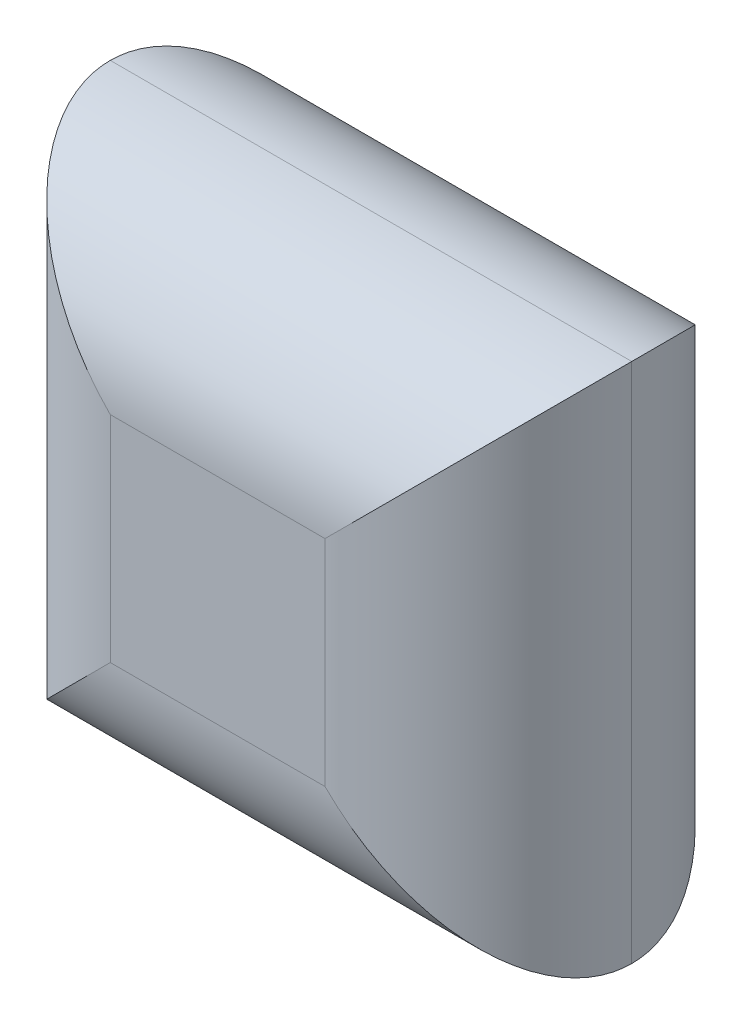
ISO-10303-21;
HEADER;
FILE_DESCRIPTION(('STEP AP214'),'2;1');
FILE_NAME('part.step','',(''),(''),'','','');
FILE_SCHEMA(('AUTOMOTIVE_DESIGN { 1 0 10303 214 1 1 1 1 }'));
ENDSEC;
DATA;
#1=APPLICATION_CONTEXT('core data for automotive mechanical design processes');
#2=APPLICATION_PROTOCOL_DEFINITION('international standard','automotive_design',2000,#1);
#3=PRODUCT_CONTEXT('',#1,'mechanical');
#4=PRODUCT('Part','Part','',(#3));
#5=PRODUCT_RELATED_PRODUCT_CATEGORY('part','',(#4));
#6=PRODUCT_DEFINITION_FORMATION('','',#4);
#7=PRODUCT_DEFINITION_CONTEXT('part definition',#1,'design');
#8=PRODUCT_DEFINITION('design','',#6,#7);
#9=PRODUCT_DEFINITION_SHAPE('','',#8);
#10=(LENGTH_UNIT() NAMED_UNIT(*) SI_UNIT(.MILLI.,.METRE.));
#11=(NAMED_UNIT(*) PLANE_ANGLE_UNIT() SI_UNIT($,.RADIAN.));
#12=(NAMED_UNIT(*) SI_UNIT($,.STERADIAN.) SOLID_ANGLE_UNIT());
#13=UNCERTAINTY_MEASURE_WITH_UNIT(LENGTH_MEASURE(1.E-05),#10,'distance_accuracy_value','');
#14=(GEOMETRIC_REPRESENTATION_CONTEXT(3) GLOBAL_UNCERTAINTY_ASSIGNED_CONTEXT((#13)) GLOBAL_UNIT_ASSIGNED_CONTEXT((#10,
#11,#12)) REPRESENTATION_CONTEXT('',''));
#15=CARTESIAN_POINT('',(0.,0.,0.));
#16=DIRECTION('',(0.,0.,1.));
#17=DIRECTION('',(1.,0.,0.));
#18=AXIS2_PLACEMENT_3D('',#15,#16,#17);
#19=CARTESIAN_POINT('',(0.,0.,100.));
#20=DIRECTION('',(0.,0.,-1.));
#21=DIRECTION('',(-1.,0.,0.));
#22=AXIS2_PLACEMENT_3D('',#19,#20,#21);
#23=PLANE('',#22);
#24=DIRECTION('',(0.,1.,0.));
#25=VECTOR('',#24,1.);
#26=CARTESIAN_POINT('',(120.,0.,100.));
#27=LINE('',#26,#25);
#28=CARTESIAN_POINT('',(120.,50.,100.));
#29=VERTEX_POINT('',#28);
#30=CARTESIAN_POINT('',(120.,120.,100.));
#31=VERTEX_POINT('',#30);
#32=EDGE_CURVE('E47',#29,#31,#27,.T.);
#33=ORIENTED_EDGE('',*,*,#32,.T.);
#34=DIRECTION('',(-1.,0.,0.));
#35=VECTOR('',#34,1.);
#36=CARTESIAN_POINT('',(0.,120.,100.));
#37=LINE('',#36,#35);
#38=CARTESIAN_POINT('',(50.,120.,100.));
#39=VERTEX_POINT('',#38);
#40=EDGE_CURVE('E11',#31,#39,#37,.T.);
#41=ORIENTED_EDGE('',*,*,#40,.T.);
#42=DIRECTION('',(0.,-1.,0.));
#43=VECTOR('',#42,1.);
#44=CARTESIAN_POINT('',(50.,0.,100.));
#45=LINE('',#44,#43);
#46=CARTESIAN_POINT('',(50.,50.,100.));
#47=VERTEX_POINT('',#46);
#48=EDGE_CURVE('E97',#39,#47,#45,.T.);
#49=ORIENTED_EDGE('',*,*,#48,.T.);
#50=DIRECTION('',(1.,0.,0.));
#51=VECTOR('',#50,1.);
#52=CARTESIAN_POINT('',(0.,50.,100.));
#53=LINE('',#52,#51);
#54=EDGE_CURVE('E100',#47,#29,#53,.T.);
#55=ORIENTED_EDGE('',*,*,#54,.T.);
#56=EDGE_LOOP('',(#33,#41,#49,#55));
#57=FACE_BOUND('',#56,.T.);
#58=ADVANCED_FACE('F37',(#57),#23,.F.);
#59=CARTESIAN_POINT('',(0.,0.,0.));
#60=DIRECTION('',(0.,0.,-1.));
#61=DIRECTION('',(-1.,0.,0.));
#62=AXIS2_PLACEMENT_3D('',#59,#60,#61);
#63=PLANE('',#62);
#64=DIRECTION('',(0.,1.,0.));
#65=VECTOR('',#64,1.);
#66=CARTESIAN_POINT('',(120.,0.,0.));
#67=LINE('',#66,#65);
#68=CARTESIAN_POINT('',(120.,120.,0.));
#69=VERTEX_POINT('',#68);
#70=CARTESIAN_POINT('',(120.,50.,0.));
#71=VERTEX_POINT('',#70);
#72=EDGE_CURVE('E144',#69,#71,#67,.F.);
#73=ORIENTED_EDGE('',*,*,#72,.T.);
#74=DIRECTION('',(1.,0.,0.));
#75=VECTOR('',#74,1.);
#76=CARTESIAN_POINT('',(0.,50.,0.));
#77=LINE('',#76,#75);
#78=CARTESIAN_POINT('',(50.,50.,0.));
#79=VERTEX_POINT('',#78);
#80=EDGE_CURVE('E101',#71,#79,#77,.F.);
#81=ORIENTED_EDGE('',*,*,#80,.T.);
#82=DIRECTION('',(0.,-1.,0.));
#83=VECTOR('',#82,1.);
#84=CARTESIAN_POINT('',(50.,170.,0.));
#85=LINE('',#84,#83);
#86=CARTESIAN_POINT('',(50.,120.,0.));
#87=VERTEX_POINT('',#86);
#88=EDGE_CURVE('E138',#79,#87,#85,.F.);
#89=ORIENTED_EDGE('',*,*,#88,.T.);
#90=DIRECTION('',(-1.,0.,0.));
#91=VECTOR('',#90,1.);
#92=CARTESIAN_POINT('',(170.,120.,0.));
#93=LINE('',#92,#91);
#94=EDGE_CURVE('E139',#87,#69,#93,.F.);
#95=ORIENTED_EDGE('',*,*,#94,.T.);
#96=EDGE_LOOP('',(#73,#81,#89,#95));
#97=FACE_BOUND('',#96,.T.);
#98=ADVANCED_FACE('F147',(#97),#63,.T.);
#99=CARTESIAN_POINT('',(0.,120.,50.));
#100=DIRECTION('',(-1.,0.,0.));
#101=DIRECTION('',(0.,0.,1.));
#102=AXIS2_PLACEMENT_3D('',#99,#100,#101);
#103=CYLINDRICAL_SURFACE('',#102,50.);
#104=CARTESIAN_POINT('',(50.,120.,50.));
#105=DIRECTION('',(-0.707106781186547,-0.707106781186547,0.));
#106=DIRECTION('',(0.707106781186547,-0.707106781186547,0.));
#107=AXIS2_PLACEMENT_3D('',#104,#105,#106);
#108=ELLIPSE('',#107,70.7106781186548,50.);
#109=CARTESIAN_POINT('',(0.,170.,50.));
#110=VERTEX_POINT('',#109);
#111=EDGE_CURVE('E41',#39,#110,#108,.T.);
#112=ORIENTED_EDGE('',*,*,#111,.F.);
#113=ORIENTED_EDGE('',*,*,#40,.F.);
#114=CARTESIAN_POINT('',(120.,120.,50.));
#115=DIRECTION('',(-0.707106781186547,0.707106781186547,0.));
#116=DIRECTION('',(0.707106781186547,0.707106781186547,0.));
#117=AXIS2_PLACEMENT_3D('',#114,#115,#116);
#118=ELLIPSE('',#117,70.7106781186548,50.);
#119=CARTESIAN_POINT('',(170.,170.,50.));
#120=VERTEX_POINT('',#119);
#121=EDGE_CURVE('E70',#120,#31,#118,.F.);
#122=ORIENTED_EDGE('',*,*,#121,.F.);
#123=DIRECTION('',(-1.,0.,0.));
#124=VECTOR('',#123,1.);
#125=CARTESIAN_POINT('',(0.,170.,50.));
#126=LINE('',#125,#124);
#127=EDGE_CURVE('E135',#110,#120,#126,.F.);
#128=ORIENTED_EDGE('',*,*,#127,.F.);
#129=EDGE_LOOP('',(#112,#113,#122,#128));
#130=FACE_BOUND('',#129,.T.);
#131=ADVANCED_FACE('F39',(#130),#103,.T.);
#132=CARTESIAN_POINT('',(50.,0.,50.));
#133=DIRECTION('',(0.,-1.,0.));
#134=DIRECTION('',(0.,0.,-1.));
#135=AXIS2_PLACEMENT_3D('',#132,#133,#134);
#136=CYLINDRICAL_SURFACE('',#135,50.);
#137=ORIENTED_EDGE('',*,*,#48,.F.);
#138=ORIENTED_EDGE('',*,*,#111,.T.);
#139=DIRECTION('',(0.,-1.,0.));
#140=VECTOR('',#139,1.);
#141=CARTESIAN_POINT('',(0.,0.,50.));
#142=LINE('',#141,#140);
#143=CARTESIAN_POINT('',(0.,0.,50.));
#144=VERTEX_POINT('',#143);
#145=EDGE_CURVE('E107',#144,#110,#142,.F.);
#146=ORIENTED_EDGE('',*,*,#145,.F.);
#147=CARTESIAN_POINT('',(50.,50.,50.));
#148=DIRECTION('',(0.707106781186547,-0.707106781186547,0.));
#149=DIRECTION('',(-0.707106781186547,-0.707106781186547,0.));
#150=AXIS2_PLACEMENT_3D('',#147,#148,#149);
#151=ELLIPSE('',#150,70.7106781186548,50.);
#152=EDGE_CURVE('E104',#47,#144,#151,.T.);
#153=ORIENTED_EDGE('',*,*,#152,.F.);
#154=EDGE_LOOP('',(#137,#138,#146,#153));
#155=FACE_BOUND('',#154,.T.);
#156=ADVANCED_FACE('F105',(#155),#136,.T.);
#157=CARTESIAN_POINT('',(120.,0.,50.));
#158=DIRECTION('',(0.,1.,0.));
#159=DIRECTION('',(0.,0.,1.));
#160=AXIS2_PLACEMENT_3D('',#157,#158,#159);
#161=CYLINDRICAL_SURFACE('',#160,50.);
#162=ORIENTED_EDGE('',*,*,#121,.T.);
#163=ORIENTED_EDGE('',*,*,#32,.F.);
#164=CARTESIAN_POINT('',(120.,50.,50.));
#165=DIRECTION('',(0.707106781186547,0.707106781186547,0.));
#166=DIRECTION('',(0.707106781186547,-0.707106781186547,0.));
#167=AXIS2_PLACEMENT_3D('',#164,#165,#166);
#168=ELLIPSE('',#167,70.7106781186548,50.);
#169=CARTESIAN_POINT('',(170.,0.,50.));
#170=VERTEX_POINT('',#169);
#171=EDGE_CURVE('E110',#170,#29,#168,.F.);
#172=ORIENTED_EDGE('',*,*,#171,.F.);
#173=DIRECTION('',(0.,1.,0.));
#174=VECTOR('',#173,1.);
#175=CARTESIAN_POINT('',(170.,0.,50.));
#176=LINE('',#175,#174);
#177=EDGE_CURVE('E127',#120,#170,#176,.F.);
#178=ORIENTED_EDGE('',*,*,#177,.F.);
#179=EDGE_LOOP('',(#162,#163,#172,#178));
#180=FACE_BOUND('',#179,.T.);
#181=ADVANCED_FACE('F154',(#180),#161,.T.);
#182=CARTESIAN_POINT('',(0.,120.,50.));
#183=DIRECTION('',(1.,0.,0.));
#184=DIRECTION('',(0.,0.,-1.));
#185=AXIS2_PLACEMENT_3D('',#182,#183,#184);
#186=CYLINDRICAL_SURFACE('',#185,50.);
#187=CARTESIAN_POINT('',(120.,120.,50.));
#188=DIRECTION('',(0.707106781186547,-0.707106781186547,0.));
#189=DIRECTION('',(0.707106781186547,0.707106781186547,0.));
#190=AXIS2_PLACEMENT_3D('',#187,#188,#189);
#191=ELLIPSE('',#190,70.7106781186548,50.);
#192=EDGE_CURVE('E124',#69,#120,#191,.T.);
#193=ORIENTED_EDGE('',*,*,#192,.F.);
#194=ORIENTED_EDGE('',*,*,#94,.F.);
#195=CARTESIAN_POINT('',(50.,120.,50.));
#196=DIRECTION('',(0.707106781186547,0.707106781186547,0.));
#197=DIRECTION('',(-0.707106781186547,0.707106781186547,0.));
#198=AXIS2_PLACEMENT_3D('',#195,#196,#197);
#199=ELLIPSE('',#198,70.7106781186548,50.);
#200=EDGE_CURVE('E132',#110,#87,#199,.F.);
#201=ORIENTED_EDGE('',*,*,#200,.F.);
#202=ORIENTED_EDGE('',*,*,#127,.T.);
#203=EDGE_LOOP('',(#193,#194,#201,#202));
#204=FACE_BOUND('',#203,.T.);
#205=ADVANCED_FACE('F156',(#204),#186,.T.);
#206=CARTESIAN_POINT('',(50.,0.,50.));
#207=DIRECTION('',(0.,1.,0.));
#208=DIRECTION('',(0.,0.,1.));
#209=AXIS2_PLACEMENT_3D('',#206,#207,#208);
#210=CYLINDRICAL_SURFACE('',#209,50.);
#211=ORIENTED_EDGE('',*,*,#200,.T.);
#212=ORIENTED_EDGE('',*,*,#88,.F.);
#213=CARTESIAN_POINT('',(50.,50.,50.));
#214=DIRECTION('',(-0.707106781186547,0.707106781186547,0.));
#215=DIRECTION('',(0.707106781186547,0.707106781186547,0.));
#216=AXIS2_PLACEMENT_3D('',#213,#214,#215);
#217=ELLIPSE('',#216,70.7106781186548,50.);
#218=EDGE_CURVE('E84',#144,#79,#217,.F.);
#219=ORIENTED_EDGE('',*,*,#218,.F.);
#220=ORIENTED_EDGE('',*,*,#145,.T.);
#221=EDGE_LOOP('',(#211,#212,#219,#220));
#222=FACE_BOUND('',#221,.T.);
#223=ADVANCED_FACE('F162',(#222),#210,.T.);
#224=CARTESIAN_POINT('',(0.,50.,50.));
#225=DIRECTION('',(1.,0.,0.));
#226=DIRECTION('',(0.,0.,-1.));
#227=AXIS2_PLACEMENT_3D('',#224,#225,#226);
#228=CYLINDRICAL_SURFACE('',#227,50.);
#229=ORIENTED_EDGE('',*,*,#54,.F.);
#230=ORIENTED_EDGE('',*,*,#152,.T.);
#231=DIRECTION('',(1.,0.,0.));
#232=VECTOR('',#231,1.);
#233=CARTESIAN_POINT('',(0.,0.,50.));
#234=LINE('',#233,#232);
#235=EDGE_CURVE('E121',#170,#144,#234,.F.);
#236=ORIENTED_EDGE('',*,*,#235,.F.);
#237=ORIENTED_EDGE('',*,*,#171,.T.);
#238=EDGE_LOOP('',(#229,#230,#236,#237));
#239=FACE_BOUND('',#238,.T.);
#240=ADVANCED_FACE('F113',(#239),#228,.T.);
#241=CARTESIAN_POINT('',(120.,0.,50.));
#242=DIRECTION('',(0.,-1.,0.));
#243=DIRECTION('',(0.,0.,-1.));
#244=AXIS2_PLACEMENT_3D('',#241,#242,#243);
#245=CYLINDRICAL_SURFACE('',#244,50.);
#246=ORIENTED_EDGE('',*,*,#192,.T.);
#247=ORIENTED_EDGE('',*,*,#177,.T.);
#248=CARTESIAN_POINT('',(120.,50.,50.));
#249=DIRECTION('',(-0.707106781186547,-0.707106781186547,0.));
#250=DIRECTION('',(0.707106781186547,-0.707106781186547,0.));
#251=AXIS2_PLACEMENT_3D('',#248,#249,#250);
#252=ELLIPSE('',#251,70.7106781186548,50.);
#253=EDGE_CURVE('E118',#71,#170,#252,.T.);
#254=ORIENTED_EDGE('',*,*,#253,.F.);
#255=ORIENTED_EDGE('',*,*,#72,.F.);
#256=EDGE_LOOP('',(#246,#247,#254,#255));
#257=FACE_BOUND('',#256,.T.);
#258=ADVANCED_FACE('F152',(#257),#245,.T.);
#259=CARTESIAN_POINT('',(0.,50.,50.));
#260=DIRECTION('',(-1.,0.,0.));
#261=DIRECTION('',(0.,0.,1.));
#262=AXIS2_PLACEMENT_3D('',#259,#260,#261);
#263=CYLINDRICAL_SURFACE('',#262,50.);
#264=ORIENTED_EDGE('',*,*,#218,.T.);
#265=ORIENTED_EDGE('',*,*,#80,.F.);
#266=ORIENTED_EDGE('',*,*,#253,.T.);
#267=ORIENTED_EDGE('',*,*,#235,.T.);
#268=EDGE_LOOP('',(#264,#265,#266,#267));
#269=FACE_BOUND('',#268,.T.);
#270=ADVANCED_FACE('F150',(#269),#263,.T.);
#271=CLOSED_SHELL('',(#58,#98,#131,#156,#181,#205,#223,#240,#258,#270));
#272=MANIFOLD_SOLID_BREP('B2',#271);
#273=ADVANCED_BREP_SHAPE_REPRESENTATION('',(#18,#272),#14);
#274=SHAPE_DEFINITION_REPRESENTATION(#9,#273);
ENDSEC;
END-ISO-10303-21;
